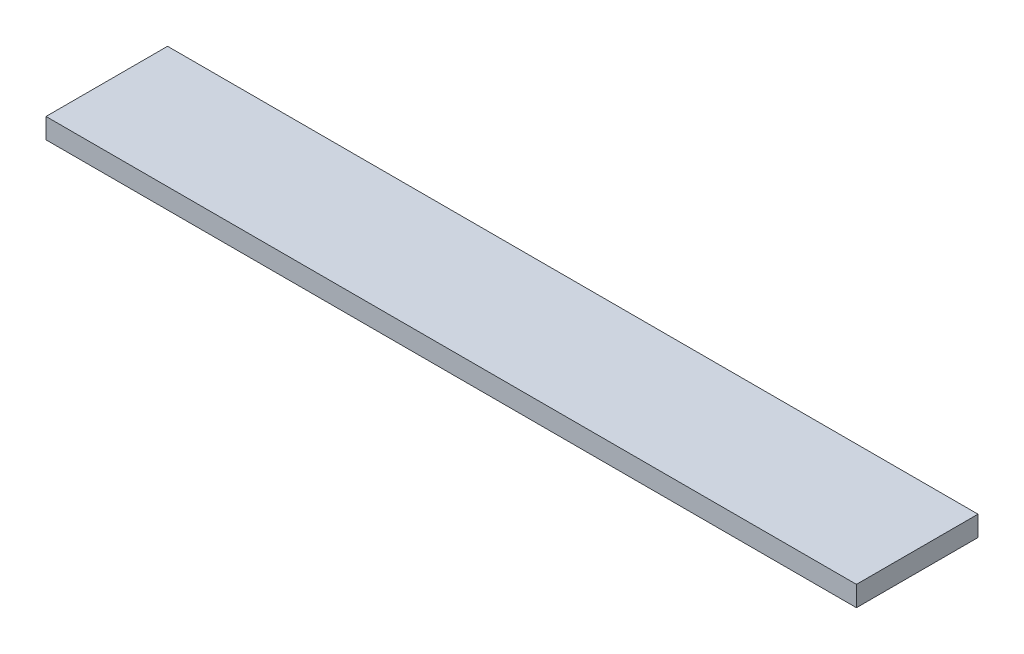
ISO-10303-21;
HEADER;
FILE_DESCRIPTION(('STEP AP214'),'2;1');
FILE_NAME('part.step','',(''),(''),'','','');
FILE_SCHEMA(('AUTOMOTIVE_DESIGN { 1 0 10303 214 1 1 1 1 }'));
ENDSEC;
DATA;
#1=APPLICATION_CONTEXT('core data for automotive mechanical design processes');
#2=APPLICATION_PROTOCOL_DEFINITION('international standard','automotive_design',2000,#1);
#3=PRODUCT_CONTEXT('',#1,'mechanical');
#4=PRODUCT('Part','Part','',(#3));
#5=PRODUCT_RELATED_PRODUCT_CATEGORY('part','',(#4));
#6=PRODUCT_DEFINITION_FORMATION('','',#4);
#7=PRODUCT_DEFINITION_CONTEXT('part definition',#1,'design');
#8=PRODUCT_DEFINITION('design','',#6,#7);
#9=PRODUCT_DEFINITION_SHAPE('','',#8);
#10=(LENGTH_UNIT() NAMED_UNIT(*) SI_UNIT(.MILLI.,.METRE.));
#11=(NAMED_UNIT(*) PLANE_ANGLE_UNIT() SI_UNIT($,.RADIAN.));
#12=(NAMED_UNIT(*) SI_UNIT($,.STERADIAN.) SOLID_ANGLE_UNIT());
#13=UNCERTAINTY_MEASURE_WITH_UNIT(LENGTH_MEASURE(1.E-05),#10,'distance_accuracy_value','');
#14=(GEOMETRIC_REPRESENTATION_CONTEXT(3) GLOBAL_UNCERTAINTY_ASSIGNED_CONTEXT((#13)) GLOBAL_UNIT_ASSIGNED_CONTEXT((#10,
#11,#12)) REPRESENTATION_CONTEXT('',''));
#15=CARTESIAN_POINT('',(0.,0.,0.));
#16=DIRECTION('',(0.,0.,1.));
#17=DIRECTION('',(1.,0.,0.));
#18=AXIS2_PLACEMENT_3D('',#15,#16,#17);
#19=CARTESIAN_POINT('',(-27.3111111111111,12.3555555555555,3.25));
#20=DIRECTION('',(1.,0.,0.));
#21=DIRECTION('',(0.,1.,0.));
#22=AXIS2_PLACEMENT_3D('',#19,#20,#21);
#23=PLANE('',#22);
#24=DIRECTION('',(0.,0.,-1.));
#25=VECTOR('',#24,1.);
#26=CARTESIAN_POINT('',(-27.3111111111111,13.3555555555555,3.25));
#27=LINE('',#26,#25);
#28=CARTESIAN_POINT('',(-27.3111111111111,13.3555555555555,3.25));
#29=VERTEX_POINT('',#28);
#30=CARTESIAN_POINT('',(-27.3111111111111,13.3555555555556,-2.75));
#31=VERTEX_POINT('',#30);
#32=EDGE_CURVE('E98',#29,#31,#27,.T.);
#33=ORIENTED_EDGE('',*,*,#32,.T.);
#34=DIRECTION('',(0.,1.,0.));
#35=VECTOR('',#34,1.);
#36=CARTESIAN_POINT('',(-27.3111111111111,12.3555555555556,-2.75));
#37=LINE('',#36,#35);
#38=CARTESIAN_POINT('',(-27.3111111111111,12.3555555555556,-2.75));
#39=VERTEX_POINT('',#38);
#40=EDGE_CURVE('E11',#39,#31,#37,.T.);
#41=ORIENTED_EDGE('',*,*,#40,.F.);
#42=DIRECTION('',(0.,0.,-1.));
#43=VECTOR('',#42,1.);
#44=CARTESIAN_POINT('',(-27.3111111111111,12.3555555555555,3.25));
#45=LINE('',#44,#43);
#46=CARTESIAN_POINT('',(-27.3111111111111,12.3555555555555,3.25));
#47=VERTEX_POINT('',#46);
#48=EDGE_CURVE('E86',#47,#39,#45,.T.);
#49=ORIENTED_EDGE('',*,*,#48,.F.);
#50=DIRECTION('',(0.,1.,0.));
#51=VECTOR('',#50,1.);
#52=CARTESIAN_POINT('',(-27.3111111111111,12.3555555555555,3.25));
#53=LINE('',#52,#51);
#54=EDGE_CURVE('E94',#47,#29,#53,.T.);
#55=ORIENTED_EDGE('',*,*,#54,.T.);
#56=EDGE_LOOP('',(#33,#41,#49,#55));
#57=FACE_BOUND('',#56,.T.);
#58=ADVANCED_FACE('F35',(#57),#23,.F.);
#59=CARTESIAN_POINT('',(-27.3111111111111,12.3555555555556,-2.75));
#60=DIRECTION('',(0.,0.,1.));
#61=DIRECTION('',(0.,-1.,0.));
#62=AXIS2_PLACEMENT_3D('',#59,#60,#61);
#63=PLANE('',#62);
#64=DIRECTION('',(1.,0.,0.));
#65=VECTOR('',#64,1.);
#66=CARTESIAN_POINT('',(-27.3111111111111,13.3555555555556,-2.75));
#67=LINE('',#66,#65);
#68=CARTESIAN_POINT('',(12.6888888888889,13.3555555555556,-2.75));
#69=VERTEX_POINT('',#68);
#70=EDGE_CURVE('E90',#31,#69,#67,.T.);
#71=ORIENTED_EDGE('',*,*,#70,.T.);
#72=DIRECTION('',(0.,1.,0.));
#73=VECTOR('',#72,1.);
#74=CARTESIAN_POINT('',(12.6888888888889,12.3555555555556,-2.75));
#75=LINE('',#74,#73);
#76=CARTESIAN_POINT('',(12.6888888888889,12.3555555555556,-2.75));
#77=VERTEX_POINT('',#76);
#78=EDGE_CURVE('E43',#77,#69,#75,.T.);
#79=ORIENTED_EDGE('',*,*,#78,.F.);
#80=DIRECTION('',(1.,0.,0.));
#81=VECTOR('',#80,1.);
#82=CARTESIAN_POINT('',(-27.3111111111111,12.3555555555556,-2.75));
#83=LINE('',#82,#81);
#84=EDGE_CURVE('E81',#39,#77,#83,.T.);
#85=ORIENTED_EDGE('',*,*,#84,.F.);
#86=ORIENTED_EDGE('',*,*,#40,.T.);
#87=EDGE_LOOP('',(#71,#79,#85,#86));
#88=FACE_BOUND('',#87,.T.);
#89=ADVANCED_FACE('F89',(#88),#63,.F.);
#90=CARTESIAN_POINT('',(12.6888888888889,12.3555555555555,3.25));
#91=DIRECTION('',(-1.,0.,0.));
#92=DIRECTION('',(0.,0.,-1.));
#93=AXIS2_PLACEMENT_3D('',#90,#91,#92);
#94=PLANE('',#93);
#95=DIRECTION('',(0.,0.,1.));
#96=VECTOR('',#95,1.);
#97=CARTESIAN_POINT('',(12.6888888888889,13.3555555555555,3.25));
#98=LINE('',#97,#96);
#99=CARTESIAN_POINT('',(12.6888888888889,13.3555555555555,3.25));
#100=VERTEX_POINT('',#99);
#101=EDGE_CURVE('E68',#69,#100,#98,.T.);
#102=ORIENTED_EDGE('',*,*,#101,.T.);
#103=DIRECTION('',(0.,1.,0.));
#104=VECTOR('',#103,1.);
#105=CARTESIAN_POINT('',(12.6888888888889,12.3555555555555,3.25));
#106=LINE('',#105,#104);
#107=CARTESIAN_POINT('',(12.6888888888889,12.3555555555555,3.25));
#108=VERTEX_POINT('',#107);
#109=EDGE_CURVE('E91',#108,#100,#106,.T.);
#110=ORIENTED_EDGE('',*,*,#109,.F.);
#111=DIRECTION('',(0.,0.,1.));
#112=VECTOR('',#111,1.);
#113=CARTESIAN_POINT('',(12.6888888888889,12.3555555555555,3.25));
#114=LINE('',#113,#112);
#115=EDGE_CURVE('E84',#77,#108,#114,.T.);
#116=ORIENTED_EDGE('',*,*,#115,.F.);
#117=ORIENTED_EDGE('',*,*,#78,.T.);
#118=EDGE_LOOP('',(#102,#110,#116,#117));
#119=FACE_BOUND('',#118,.T.);
#120=ADVANCED_FACE('F92',(#119),#94,.F.);
#121=CARTESIAN_POINT('',(-27.3111111111111,12.3555555555555,3.25));
#122=DIRECTION('',(0.,0.,-1.));
#123=DIRECTION('',(0.,1.,0.));
#124=AXIS2_PLACEMENT_3D('',#121,#122,#123);
#125=PLANE('',#124);
#126=DIRECTION('',(-1.,0.,0.));
#127=VECTOR('',#126,1.);
#128=CARTESIAN_POINT('',(-27.3111111111111,13.3555555555555,3.25));
#129=LINE('',#128,#127);
#130=EDGE_CURVE('E74',#100,#29,#129,.T.);
#131=ORIENTED_EDGE('',*,*,#130,.T.);
#132=ORIENTED_EDGE('',*,*,#54,.F.);
#133=DIRECTION('',(-1.,0.,0.));
#134=VECTOR('',#133,1.);
#135=CARTESIAN_POINT('',(-27.3111111111111,12.3555555555555,3.25));
#136=LINE('',#135,#134);
#137=EDGE_CURVE('E51',#108,#47,#136,.T.);
#138=ORIENTED_EDGE('',*,*,#137,.F.);
#139=ORIENTED_EDGE('',*,*,#109,.T.);
#140=EDGE_LOOP('',(#131,#132,#138,#139));
#141=FACE_BOUND('',#140,.T.);
#142=ADVANCED_FACE('F105',(#141),#125,.F.);
#143=CARTESIAN_POINT('',(0.,12.3555555555556,-12.8555555555556));
#144=DIRECTION('',(0.,-1.,0.));
#145=DIRECTION('',(1.,0.,0.));
#146=AXIS2_PLACEMENT_3D('',#143,#144,#145);
#147=PLANE('',#146);
#148=ORIENTED_EDGE('',*,*,#48,.T.);
#149=ORIENTED_EDGE('',*,*,#84,.T.);
#150=ORIENTED_EDGE('',*,*,#115,.T.);
#151=ORIENTED_EDGE('',*,*,#137,.T.);
#152=EDGE_LOOP('',(#148,#149,#150,#151));
#153=FACE_BOUND('',#152,.T.);
#154=ADVANCED_FACE('F82',(#153),#147,.T.);
#155=CARTESIAN_POINT('',(0.,13.3555555555556,-12.8555555555555));
#156=DIRECTION('',(0.,-1.,0.));
#157=DIRECTION('',(1.,0.,0.));
#158=AXIS2_PLACEMENT_3D('',#155,#156,#157);
#159=PLANE('',#158);
#160=ORIENTED_EDGE('',*,*,#32,.F.);
#161=ORIENTED_EDGE('',*,*,#130,.F.);
#162=ORIENTED_EDGE('',*,*,#101,.F.);
#163=ORIENTED_EDGE('',*,*,#70,.F.);
#164=EDGE_LOOP('',(#160,#161,#162,#163));
#165=FACE_BOUND('',#164,.T.);
#166=ADVANCED_FACE('F108',(#165),#159,.F.);
#167=CLOSED_SHELL('',(#58,#89,#120,#142,#154,#166));
#168=MANIFOLD_SOLID_BREP('B2',#167);
#169=ADVANCED_BREP_SHAPE_REPRESENTATION('',(#18,#168),#14);
#170=SHAPE_DEFINITION_REPRESENTATION(#9,#169);
ENDSEC;
END-ISO-10303-21;
